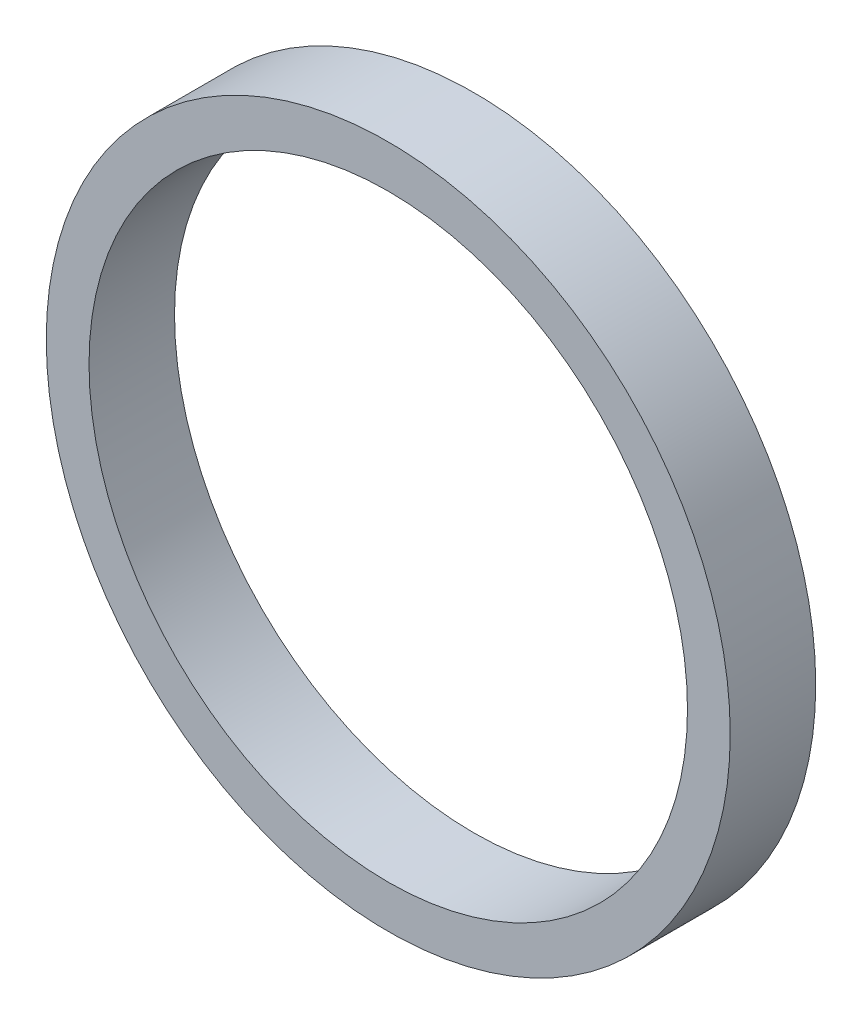
ISO-10303-21;
HEADER;
FILE_DESCRIPTION(('STEP AP214'),'2;1');
FILE_NAME('part.step','',(''),(''),'','','');
FILE_SCHEMA(('AUTOMOTIVE_DESIGN { 1 0 10303 214 1 1 1 1 }'));
ENDSEC;
DATA;
#1=APPLICATION_CONTEXT('core data for automotive mechanical design processes');
#2=APPLICATION_PROTOCOL_DEFINITION('international standard','automotive_design',2000,#1);
#3=PRODUCT_CONTEXT('',#1,'mechanical');
#4=PRODUCT('Part','Part','',(#3));
#5=PRODUCT_RELATED_PRODUCT_CATEGORY('part','',(#4));
#6=PRODUCT_DEFINITION_FORMATION('','',#4);
#7=PRODUCT_DEFINITION_CONTEXT('part definition',#1,'design');
#8=PRODUCT_DEFINITION('design','',#6,#7);
#9=PRODUCT_DEFINITION_SHAPE('','',#8);
#10=(LENGTH_UNIT() NAMED_UNIT(*) SI_UNIT(.MILLI.,.METRE.));
#11=(NAMED_UNIT(*) PLANE_ANGLE_UNIT() SI_UNIT($,.RADIAN.));
#12=(NAMED_UNIT(*) SI_UNIT($,.STERADIAN.) SOLID_ANGLE_UNIT());
#13=UNCERTAINTY_MEASURE_WITH_UNIT(LENGTH_MEASURE(1.E-05),#10,'distance_accuracy_value','');
#14=(GEOMETRIC_REPRESENTATION_CONTEXT(3) GLOBAL_UNCERTAINTY_ASSIGNED_CONTEXT((#13)) GLOBAL_UNIT_ASSIGNED_CONTEXT((#10,
#11,#12)) REPRESENTATION_CONTEXT('',''));
#15=CARTESIAN_POINT('',(0.,0.,0.));
#16=DIRECTION('',(0.,0.,1.));
#17=DIRECTION('',(1.,0.,0.));
#18=AXIS2_PLACEMENT_3D('',#15,#16,#17);
#19=CARTESIAN_POINT('',(0.,0.,5.));
#20=DIRECTION('',(0.,0.,-1.));
#21=DIRECTION('',(-1.,0.,0.));
#22=AXIS2_PLACEMENT_3D('',#19,#20,#21);
#23=CYLINDRICAL_SURFACE('',#22,40.);
#24=CARTESIAN_POINT('',(0.,0.,5.));
#25=DIRECTION('',(0.,0.,1.));
#26=DIRECTION('',(1.,0.,0.));
#27=AXIS2_PLACEMENT_3D('',#24,#25,#26);
#28=CIRCLE('',#27,40.);
#29=CARTESIAN_POINT('',(40.,0.,5.));
#30=VERTEX_POINT('',#29);
#31=EDGE_CURVE('E10',#30,#30,#28,.T.);
#32=ORIENTED_EDGE('',*,*,#31,.F.);
#33=EDGE_LOOP('',(#32));
#34=FACE_BOUND('',#33,.T.);
#35=CARTESIAN_POINT('',(0.,0.,-5.));
#36=DIRECTION('',(0.,0.,1.));
#37=DIRECTION('',(1.,0.,0.));
#38=AXIS2_PLACEMENT_3D('',#35,#36,#37);
#39=CIRCLE('',#38,40.);
#40=CARTESIAN_POINT('',(40.,0.,-5.));
#41=VERTEX_POINT('',#40);
#42=EDGE_CURVE('E40',#41,#41,#39,.T.);
#43=ORIENTED_EDGE('',*,*,#42,.T.);
#44=EDGE_LOOP('',(#43));
#45=FACE_BOUND('',#44,.T.);
#46=ADVANCED_FACE('F37',(#34,#45),#23,.T.);
#47=CARTESIAN_POINT('',(0.,0.,5.));
#48=DIRECTION('',(0.,0.,1.));
#49=DIRECTION('',(1.,0.,0.));
#50=AXIS2_PLACEMENT_3D('',#47,#48,#49);
#51=PLANE('',#50);
#52=CARTESIAN_POINT('',(0.,0.,5.));
#53=DIRECTION('',(0.,0.,1.));
#54=DIRECTION('',(1.,0.,0.));
#55=AXIS2_PLACEMENT_3D('',#52,#53,#54);
#56=CIRCLE('',#55,35.);
#57=CARTESIAN_POINT('',(35.,0.,5.));
#58=VERTEX_POINT('',#57);
#59=EDGE_CURVE('E51',#58,#58,#56,.T.);
#60=ORIENTED_EDGE('',*,*,#59,.F.);
#61=EDGE_LOOP('',(#60));
#62=FACE_BOUND('',#61,.T.);
#63=ORIENTED_EDGE('',*,*,#31,.T.);
#64=EDGE_LOOP('',(#63));
#65=FACE_BOUND('',#64,.T.);
#66=ADVANCED_FACE('F68',(#62,#65),#51,.T.);
#67=CARTESIAN_POINT('',(0.,0.,-5.));
#68=DIRECTION('',(0.,0.,1.));
#69=DIRECTION('',(1.,0.,0.));
#70=AXIS2_PLACEMENT_3D('',#67,#68,#69);
#71=PLANE('',#70);
#72=CARTESIAN_POINT('',(0.,0.,-5.));
#73=DIRECTION('',(0.,0.,1.));
#74=DIRECTION('',(1.,0.,0.));
#75=AXIS2_PLACEMENT_3D('',#72,#73,#74);
#76=CIRCLE('',#75,35.);
#77=CARTESIAN_POINT('',(35.,0.,-5.));
#78=VERTEX_POINT('',#77);
#79=EDGE_CURVE('E49',#78,#78,#76,.T.);
#80=ORIENTED_EDGE('',*,*,#79,.T.);
#81=EDGE_LOOP('',(#80));
#82=FACE_BOUND('',#81,.T.);
#83=ORIENTED_EDGE('',*,*,#42,.F.);
#84=EDGE_LOOP('',(#83));
#85=FACE_BOUND('',#84,.T.);
#86=ADVANCED_FACE('F59',(#82,#85),#71,.F.);
#87=CARTESIAN_POINT('',(0.,0.,-5.));
#88=DIRECTION('',(0.,0.,1.));
#89=DIRECTION('',(1.,0.,0.));
#90=AXIS2_PLACEMENT_3D('',#87,#88,#89);
#91=CYLINDRICAL_SURFACE('',#90,35.);
#92=ORIENTED_EDGE('',*,*,#79,.F.);
#93=EDGE_LOOP('',(#92));
#94=FACE_BOUND('',#93,.T.);
#95=ORIENTED_EDGE('',*,*,#59,.T.);
#96=EDGE_LOOP('',(#95));
#97=FACE_BOUND('',#96,.T.);
#98=ADVANCED_FACE('F62',(#94,#97),#91,.F.);
#99=CLOSED_SHELL('',(#46,#66,#86,#98));
#100=MANIFOLD_SOLID_BREP('B2',#99);
#101=ADVANCED_BREP_SHAPE_REPRESENTATION('',(#18,#100),#14);
#102=SHAPE_DEFINITION_REPRESENTATION(#9,#101);
ENDSEC;
END-ISO-10303-21;
